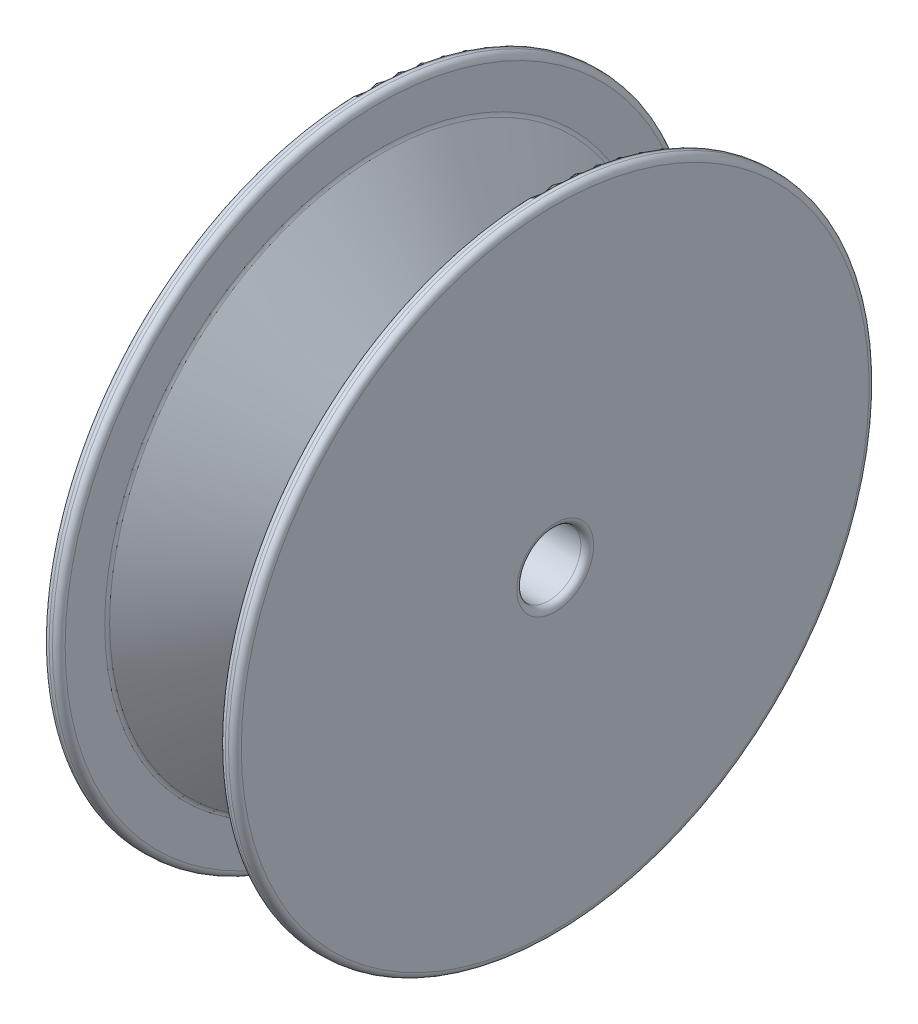
ISO-10303-21;
HEADER;
FILE_DESCRIPTION(('STEP AP214'),'2;1');
FILE_NAME('part.step','',(''),(''),'','','');
FILE_SCHEMA(('AUTOMOTIVE_DESIGN { 1 0 10303 214 1 1 1 1 }'));
ENDSEC;
DATA;
#1=APPLICATION_CONTEXT('core data for automotive mechanical design processes');
#2=APPLICATION_PROTOCOL_DEFINITION('international standard','automotive_design',2000,#1);
#3=PRODUCT_CONTEXT('',#1,'mechanical');
#4=PRODUCT('Part','Part','',(#3));
#5=PRODUCT_RELATED_PRODUCT_CATEGORY('part','',(#4));
#6=PRODUCT_DEFINITION_FORMATION('','',#4);
#7=PRODUCT_DEFINITION_CONTEXT('part definition',#1,'design');
#8=PRODUCT_DEFINITION('design','',#6,#7);
#9=PRODUCT_DEFINITION_SHAPE('','',#8);
#10=(LENGTH_UNIT() NAMED_UNIT(*) SI_UNIT(.MILLI.,.METRE.));
#11=(NAMED_UNIT(*) PLANE_ANGLE_UNIT() SI_UNIT($,.RADIAN.));
#12=(NAMED_UNIT(*) SI_UNIT($,.STERADIAN.) SOLID_ANGLE_UNIT());
#13=UNCERTAINTY_MEASURE_WITH_UNIT(LENGTH_MEASURE(1.E-05),#10,'distance_accuracy_value','');
#14=(GEOMETRIC_REPRESENTATION_CONTEXT(3) GLOBAL_UNCERTAINTY_ASSIGNED_CONTEXT((#13)) GLOBAL_UNIT_ASSIGNED_CONTEXT((#10,
#11,#12)) REPRESENTATION_CONTEXT('',''));
#15=CARTESIAN_POINT('',(0.,0.,0.));
#16=DIRECTION('',(0.,0.,1.));
#17=DIRECTION('',(1.,0.,0.));
#18=AXIS2_PLACEMENT_3D('',#15,#16,#17);
#19=CARTESIAN_POINT('',(0.,0.,0.));
#20=DIRECTION('',(-1.,0.,0.));
#21=DIRECTION('',(0.,0.,1.));
#22=AXIS2_PLACEMENT_3D('',#19,#20,#21);
#23=CYLINDRICAL_SURFACE('',#22,1.);
#24=CARTESIAN_POINT('',(2.8,0.,0.));
#25=DIRECTION('',(-1.,0.,0.));
#26=DIRECTION('',(0.,0.,1.));
#27=AXIS2_PLACEMENT_3D('',#24,#25,#26);
#28=CIRCLE('',#27,1.);
#29=CARTESIAN_POINT('',(2.8,0.,1.));
#30=VERTEX_POINT('',#29);
#31=EDGE_CURVE('E52',#30,#30,#28,.F.);
#32=ORIENTED_EDGE('',*,*,#31,.T.);
#33=EDGE_LOOP('',(#32));
#34=FACE_BOUND('',#33,.T.);
#35=CARTESIAN_POINT('',(-2.8,0.,0.));
#36=DIRECTION('',(1.,0.,0.));
#37=DIRECTION('',(0.,0.,-1.));
#38=AXIS2_PLACEMENT_3D('',#35,#36,#37);
#39=CIRCLE('',#38,1.);
#40=CARTESIAN_POINT('',(-2.8,0.,-1.));
#41=VERTEX_POINT('',#40);
#42=EDGE_CURVE('E56',#41,#41,#39,.F.);
#43=ORIENTED_EDGE('',*,*,#42,.T.);
#44=EDGE_LOOP('',(#43));
#45=FACE_BOUND('',#44,.T.);
#46=ADVANCED_FACE('F39',(#34,#45),#23,.F.);
#47=CARTESIAN_POINT('',(3.,1.,0.));
#48=DIRECTION('',(-1.,0.,0.));
#49=DIRECTION('',(0.,0.,1.));
#50=AXIS2_PLACEMENT_3D('',#47,#48,#49);
#51=PLANE('',#50);
#52=CARTESIAN_POINT('',(3.,0.,0.));
#53=DIRECTION('',(-1.,0.,0.));
#54=DIRECTION('',(0.,0.,1.));
#55=AXIS2_PLACEMENT_3D('',#52,#53,#54);
#56=CIRCLE('',#55,1.2);
#57=CARTESIAN_POINT('',(3.,0.,1.2));
#58=VERTEX_POINT('',#57);
#59=EDGE_CURVE('E61',#58,#58,#56,.T.);
#60=ORIENTED_EDGE('',*,*,#59,.T.);
#61=EDGE_LOOP('',(#60));
#62=FACE_BOUND('',#61,.T.);
#63=CARTESIAN_POINT('',(3.,0.,0.));
#64=DIRECTION('',(-1.,0.,0.));
#65=DIRECTION('',(0.,0.,1.));
#66=AXIS2_PLACEMENT_3D('',#63,#64,#65);
#67=CIRCLE('',#66,9.8);
#68=CARTESIAN_POINT('',(3.,0.,9.8));
#69=VERTEX_POINT('',#68);
#70=EDGE_CURVE('E64',#69,#69,#67,.F.);
#71=ORIENTED_EDGE('',*,*,#70,.T.);
#72=EDGE_LOOP('',(#71));
#73=FACE_BOUND('',#72,.T.);
#74=ADVANCED_FACE('F144',(#62,#73),#51,.F.);
#75=CARTESIAN_POINT('',(0.,0.,0.));
#76=DIRECTION('',(-1.,0.,0.));
#77=DIRECTION('',(0.,0.,1.));
#78=AXIS2_PLACEMENT_3D('',#75,#76,#77);
#79=CYLINDRICAL_SURFACE('',#78,10.);
#80=CARTESIAN_POINT('',(2.69999999999999,0.,0.));
#81=DIRECTION('',(1.,0.,0.));
#82=DIRECTION('',(0.,0.,-1.));
#83=AXIS2_PLACEMENT_3D('',#80,#81,#82);
#84=CIRCLE('',#83,10.);
#85=CARTESIAN_POINT('',(2.69999999999999,0.,-10.));
#86=VERTEX_POINT('',#85);
#87=EDGE_CURVE('E92',#86,#86,#84,.T.);
#88=ORIENTED_EDGE('',*,*,#87,.T.);
#89=EDGE_LOOP('',(#88));
#90=FACE_BOUND('',#89,.T.);
#91=CARTESIAN_POINT('',(2.8,0.,0.));
#92=DIRECTION('',(-1.,0.,0.));
#93=DIRECTION('',(0.,0.,1.));
#94=AXIS2_PLACEMENT_3D('',#91,#92,#93);
#95=CIRCLE('',#94,10.);
#96=CARTESIAN_POINT('',(2.8,0.,10.));
#97=VERTEX_POINT('',#96);
#98=EDGE_CURVE('E95',#97,#97,#95,.T.);
#99=ORIENTED_EDGE('',*,*,#98,.T.);
#100=EDGE_LOOP('',(#99));
#101=FACE_BOUND('',#100,.T.);
#102=ADVANCED_FACE('F149',(#90,#101),#79,.T.);
#103=CARTESIAN_POINT('',(2.49999999999999,8.5,0.));
#104=DIRECTION('',(1.,0.,0.));
#105=DIRECTION('',(0.,0.,-1.));
#106=AXIS2_PLACEMENT_3D('',#103,#104,#105);
#107=PLANE('',#106);
#108=CARTESIAN_POINT('',(2.49999999999999,0.,0.));
#109=DIRECTION('',(1.,0.,0.));
#110=DIRECTION('',(0.,0.,-1.));
#111=AXIS2_PLACEMENT_3D('',#108,#109,#110);
#112=CIRCLE('',#111,9.8);
#113=CARTESIAN_POINT('',(2.49999999999999,0.,-9.8));
#114=VERTEX_POINT('',#113);
#115=EDGE_CURVE('E98',#114,#114,#112,.F.);
#116=ORIENTED_EDGE('',*,*,#115,.T.);
#117=EDGE_LOOP('',(#116));
#118=FACE_BOUND('',#117,.T.);
#119=CARTESIAN_POINT('',(2.49999999999999,0.,0.));
#120=DIRECTION('',(1.,0.,0.));
#121=DIRECTION('',(0.,0.,-1.));
#122=AXIS2_PLACEMENT_3D('',#119,#120,#121);
#123=CIRCLE('',#122,8.56409301068169);
#124=CARTESIAN_POINT('',(2.49999999999999,0.,-8.56409301068169));
#125=VERTEX_POINT('',#124);
#126=EDGE_CURVE('E101',#125,#125,#123,.T.);
#127=ORIENTED_EDGE('',*,*,#126,.T.);
#128=EDGE_LOOP('',(#127));
#129=FACE_BOUND('',#128,.T.);
#130=ADVANCED_FACE('F172',(#118,#129),#107,.F.);
#131=CARTESIAN_POINT('',(2.5,0.,0.));
#132=DIRECTION('',(1.,0.,0.));
#133=DIRECTION('',(0.,0.,-1.));
#134=AXIS2_PLACEMENT_3D('',#131,#132,#133);
#135=CONICAL_SURFACE('',#134,8.5,0.95054684081207);
#136=CARTESIAN_POINT('',(2.46274669424133,0.,0.));
#137=DIRECTION('',(1.,0.,0.));
#138=DIRECTION('',(0.,0.,-1.));
#139=AXIS2_PLACEMENT_3D('',#136,#137,#138);
#140=CIRCLE('',#139,8.44784537193787);
#141=CARTESIAN_POINT('',(2.46274669424133,0.,-8.44784537193787));
#142=VERTEX_POINT('',#141);
#143=EDGE_CURVE('E86',#142,#142,#140,.F.);
#144=ORIENTED_EDGE('',*,*,#143,.T.);
#145=EDGE_LOOP('',(#144));
#146=FACE_BOUND('',#145,.T.);
#147=CARTESIAN_POINT('',(0.162746694241322,0.,0.));
#148=DIRECTION('',(1.,0.,0.));
#149=DIRECTION('',(0.,0.,-1.));
#150=AXIS2_PLACEMENT_3D('',#147,#148,#149);
#151=CIRCLE('',#150,5.22784537193789);
#152=CARTESIAN_POINT('',(0.162746694241322,0.,-5.22784537193789));
#153=VERTEX_POINT('',#152);
#154=EDGE_CURVE('E89',#153,#153,#151,.T.);
#155=ORIENTED_EDGE('',*,*,#154,.T.);
#156=EDGE_LOOP('',(#155));
#157=FACE_BOUND('',#156,.T.);
#158=ADVANCED_FACE('F178',(#146,#157),#135,.T.);
#159=CARTESIAN_POINT('',(0.,0.,0.));
#160=DIRECTION('',(-1.,0.,0.));
#161=DIRECTION('',(0.,0.,1.));
#162=AXIS2_PLACEMENT_3D('',#159,#160,#161);
#163=CONICAL_SURFACE('',#162,5.,0.95054684081208);
#164=CARTESIAN_POINT('',(-0.162746694241372,0.,0.));
#165=DIRECTION('',(-1.,0.,0.));
#166=DIRECTION('',(0.,0.,1.));
#167=AXIS2_PLACEMENT_3D('',#164,#165,#166);
#168=CIRCLE('',#167,5.22784537193789);
#169=CARTESIAN_POINT('',(-0.162746694241372,0.,5.22784537193789));
#170=VERTEX_POINT('',#169);
#171=EDGE_CURVE('E80',#170,#170,#168,.T.);
#172=ORIENTED_EDGE('',*,*,#171,.T.);
#173=EDGE_LOOP('',(#172));
#174=FACE_BOUND('',#173,.T.);
#175=CARTESIAN_POINT('',(-2.46274669424135,0.,0.));
#176=DIRECTION('',(-1.,0.,0.));
#177=DIRECTION('',(0.,0.,1.));
#178=AXIS2_PLACEMENT_3D('',#175,#176,#177);
#179=CIRCLE('',#178,8.44784537193789);
#180=CARTESIAN_POINT('',(-2.46274669424135,0.,8.44784537193789));
#181=VERTEX_POINT('',#180);
#182=EDGE_CURVE('E83',#181,#181,#179,.F.);
#183=ORIENTED_EDGE('',*,*,#182,.T.);
#184=EDGE_LOOP('',(#183));
#185=FACE_BOUND('',#184,.T.);
#186=ADVANCED_FACE('F184',(#174,#185),#163,.T.);
#187=CARTESIAN_POINT('',(-2.5,10.,0.));
#188=DIRECTION('',(-1.,0.,0.));
#189=DIRECTION('',(0.,0.,1.));
#190=AXIS2_PLACEMENT_3D('',#187,#188,#189);
#191=PLANE('',#190);
#192=CARTESIAN_POINT('',(-2.5,0.,0.));
#193=DIRECTION('',(-1.,0.,0.));
#194=DIRECTION('',(0.,0.,1.));
#195=AXIS2_PLACEMENT_3D('',#192,#193,#194);
#196=CIRCLE('',#195,8.5640930106817);
#197=CARTESIAN_POINT('',(-2.5,0.,8.5640930106817));
#198=VERTEX_POINT('',#197);
#199=EDGE_CURVE('E74',#198,#198,#196,.T.);
#200=ORIENTED_EDGE('',*,*,#199,.T.);
#201=EDGE_LOOP('',(#200));
#202=FACE_BOUND('',#201,.T.);
#203=CARTESIAN_POINT('',(-2.5,0.,0.));
#204=DIRECTION('',(-1.,0.,0.));
#205=DIRECTION('',(0.,0.,1.));
#206=AXIS2_PLACEMENT_3D('',#203,#204,#205);
#207=CIRCLE('',#206,9.8);
#208=CARTESIAN_POINT('',(-2.5,0.,9.8));
#209=VERTEX_POINT('',#208);
#210=EDGE_CURVE('E77',#209,#209,#207,.F.);
#211=ORIENTED_EDGE('',*,*,#210,.T.);
#212=EDGE_LOOP('',(#211));
#213=FACE_BOUND('',#212,.T.);
#214=ADVANCED_FACE('F188',(#202,#213),#191,.F.);
#215=CARTESIAN_POINT('',(0.,0.,0.));
#216=DIRECTION('',(-1.,0.,0.));
#217=DIRECTION('',(0.,0.,1.));
#218=AXIS2_PLACEMENT_3D('',#215,#216,#217);
#219=CYLINDRICAL_SURFACE('',#218,10.);
#220=CARTESIAN_POINT('',(-2.7,0.,0.));
#221=DIRECTION('',(-1.,0.,0.));
#222=DIRECTION('',(0.,0.,1.));
#223=AXIS2_PLACEMENT_3D('',#220,#221,#222);
#224=CIRCLE('',#223,10.);
#225=CARTESIAN_POINT('',(-2.7,0.,10.));
#226=VERTEX_POINT('',#225);
#227=EDGE_CURVE('E67',#226,#226,#224,.T.);
#228=ORIENTED_EDGE('',*,*,#227,.T.);
#229=EDGE_LOOP('',(#228));
#230=FACE_BOUND('',#229,.T.);
#231=CARTESIAN_POINT('',(-2.8,0.,0.));
#232=DIRECTION('',(1.,0.,0.));
#233=DIRECTION('',(0.,0.,-1.));
#234=AXIS2_PLACEMENT_3D('',#231,#232,#233);
#235=CIRCLE('',#234,10.);
#236=CARTESIAN_POINT('',(-2.8,0.,-10.));
#237=VERTEX_POINT('',#236);
#238=EDGE_CURVE('E69',#237,#237,#235,.T.);
#239=ORIENTED_EDGE('',*,*,#238,.T.);
#240=EDGE_LOOP('',(#239));
#241=FACE_BOUND('',#240,.T.);
#242=ADVANCED_FACE('F123',(#230,#241),#219,.T.);
#243=CARTESIAN_POINT('',(-3.,1.,0.));
#244=DIRECTION('',(1.,0.,0.));
#245=DIRECTION('',(0.,0.,-1.));
#246=AXIS2_PLACEMENT_3D('',#243,#244,#245);
#247=PLANE('',#246);
#248=CARTESIAN_POINT('',(-3.,-6.53003817560782,0.));
#249=DIRECTION('',(-1.,0.,0.));
#250=DIRECTION('',(0.,0.,-1.));
#251=AXIS2_PLACEMENT_3D('',#248,#249,#250);
#252=CIRCLE('',#251,0.843426549744777);
#253=CARTESIAN_POINT('',(-3.,-6.53003817560782,-0.843426549744777));
#254=VERTEX_POINT('',#253);
#255=EDGE_CURVE('E113',#254,#254,#252,.T.);
#256=ORIENTED_EDGE('',*,*,#255,.F.);
#257=EDGE_LOOP('',(#256));
#258=FACE_BOUND('',#257,.T.);
#259=CARTESIAN_POINT('',(-3.,6.53003817560782,0.));
#260=DIRECTION('',(-1.,0.,0.));
#261=DIRECTION('',(0.,0.,1.));
#262=AXIS2_PLACEMENT_3D('',#259,#260,#261);
#263=CIRCLE('',#262,0.843426549744777);
#264=CARTESIAN_POINT('',(-3.,6.53003817560782,0.843426549744777));
#265=VERTEX_POINT('',#264);
#266=EDGE_CURVE('E107',#265,#265,#263,.T.);
#267=ORIENTED_EDGE('',*,*,#266,.F.);
#268=EDGE_LOOP('',(#267));
#269=FACE_BOUND('',#268,.T.);
#270=CARTESIAN_POINT('',(-3.,0.,0.));
#271=DIRECTION('',(1.,0.,0.));
#272=DIRECTION('',(0.,0.,-1.));
#273=AXIS2_PLACEMENT_3D('',#270,#271,#272);
#274=CIRCLE('',#273,9.8);
#275=CARTESIAN_POINT('',(-3.,0.,-9.8));
#276=VERTEX_POINT('',#275);
#277=EDGE_CURVE('E11',#276,#276,#274,.F.);
#278=ORIENTED_EDGE('',*,*,#277,.T.);
#279=EDGE_LOOP('',(#278));
#280=FACE_BOUND('',#279,.T.);
#281=CARTESIAN_POINT('',(-3.,0.,0.));
#282=DIRECTION('',(1.,0.,0.));
#283=DIRECTION('',(0.,0.,-1.));
#284=AXIS2_PLACEMENT_3D('',#281,#282,#283);
#285=CIRCLE('',#284,1.2);
#286=CARTESIAN_POINT('',(-3.,0.,-1.2));
#287=VERTEX_POINT('',#286);
#288=EDGE_CURVE('E46',#287,#287,#285,.T.);
#289=ORIENTED_EDGE('',*,*,#288,.T.);
#290=EDGE_LOOP('',(#289));
#291=FACE_BOUND('',#290,.T.);
#292=ADVANCED_FACE('F119',(#258,#269,#280,#291),#247,.F.);
#293=CARTESIAN_POINT('',(2.69999999999999,0.,0.));
#294=DIRECTION('',(1.,0.,0.));
#295=DIRECTION('',(0.,0.,-1.));
#296=AXIS2_PLACEMENT_3D('',#293,#294,#295);
#297=TOROIDAL_SURFACE('',#296,9.8,0.2);
#298=ORIENTED_EDGE('',*,*,#87,.F.);
#299=EDGE_LOOP('',(#298));
#300=FACE_BOUND('',#299,.T.);
#301=ORIENTED_EDGE('',*,*,#115,.F.);
#302=EDGE_LOOP('',(#301));
#303=FACE_BOUND('',#302,.T.);
#304=ADVANCED_FACE('F122',(#300,#303),#297,.T.);
#305=CARTESIAN_POINT('',(2.29999999999999,0.,0.));
#306=DIRECTION('',(1.,0.,0.));
#307=DIRECTION('',(0.,0.,-1.));
#308=AXIS2_PLACEMENT_3D('',#305,#306,#307);
#309=TOROIDAL_SURFACE('',#308,8.56409301068169,0.2);
#310=ORIENTED_EDGE('',*,*,#126,.F.);
#311=EDGE_LOOP('',(#310));
#312=FACE_BOUND('',#311,.T.);
#313=ORIENTED_EDGE('',*,*,#143,.F.);
#314=EDGE_LOOP('',(#313));
#315=FACE_BOUND('',#314,.T.);
#316=ADVANCED_FACE('F198',(#312,#315),#309,.F.);
#317=CARTESIAN_POINT('',(0.,0.,0.));
#318=DIRECTION('',(-1.,0.,0.));
#319=DIRECTION('',(0.,0.,1.));
#320=AXIS2_PLACEMENT_3D('',#317,#318,#319);
#321=TOROIDAL_SURFACE('',#320,5.34409301068171,0.2);
#322=ORIENTED_EDGE('',*,*,#154,.F.);
#323=EDGE_LOOP('',(#322));
#324=FACE_BOUND('',#323,.T.);
#325=ORIENTED_EDGE('',*,*,#171,.F.);
#326=EDGE_LOOP('',(#325));
#327=FACE_BOUND('',#326,.T.);
#328=ADVANCED_FACE('F202',(#324,#327),#321,.F.);
#329=CARTESIAN_POINT('',(-2.3,0.,0.));
#330=DIRECTION('',(-1.,0.,0.));
#331=DIRECTION('',(0.,0.,1.));
#332=AXIS2_PLACEMENT_3D('',#329,#330,#331);
#333=TOROIDAL_SURFACE('',#332,8.5640930106817,0.2);
#334=ORIENTED_EDGE('',*,*,#182,.F.);
#335=EDGE_LOOP('',(#334));
#336=FACE_BOUND('',#335,.T.);
#337=ORIENTED_EDGE('',*,*,#199,.F.);
#338=EDGE_LOOP('',(#337));
#339=FACE_BOUND('',#338,.T.);
#340=ADVANCED_FACE('F206',(#336,#339),#333,.F.);
#341=CARTESIAN_POINT('',(-2.7,0.,0.));
#342=DIRECTION('',(-1.,0.,0.));
#343=DIRECTION('',(0.,0.,1.));
#344=AXIS2_PLACEMENT_3D('',#341,#342,#343);
#345=TOROIDAL_SURFACE('',#344,9.8,0.2);
#346=ORIENTED_EDGE('',*,*,#210,.F.);
#347=EDGE_LOOP('',(#346));
#348=FACE_BOUND('',#347,.T.);
#349=ORIENTED_EDGE('',*,*,#227,.F.);
#350=EDGE_LOOP('',(#349));
#351=FACE_BOUND('',#350,.T.);
#352=ADVANCED_FACE('F160',(#348,#351),#345,.T.);
#353=CARTESIAN_POINT('',(2.8,0.,0.));
#354=DIRECTION('',(-1.,0.,0.));
#355=DIRECTION('',(0.,0.,1.));
#356=AXIS2_PLACEMENT_3D('',#353,#354,#355);
#357=TOROIDAL_SURFACE('',#356,1.2,0.2);
#358=ORIENTED_EDGE('',*,*,#31,.F.);
#359=EDGE_LOOP('',(#358));
#360=FACE_BOUND('',#359,.T.);
#361=ORIENTED_EDGE('',*,*,#59,.F.);
#362=EDGE_LOOP('',(#361));
#363=FACE_BOUND('',#362,.T.);
#364=ADVANCED_FACE('F156',(#360,#363),#357,.T.);
#365=CARTESIAN_POINT('',(2.8,0.,0.));
#366=DIRECTION('',(-1.,0.,0.));
#367=DIRECTION('',(0.,0.,1.));
#368=AXIS2_PLACEMENT_3D('',#365,#366,#367);
#369=TOROIDAL_SURFACE('',#368,9.8,0.2);
#370=ORIENTED_EDGE('',*,*,#70,.F.);
#371=EDGE_LOOP('',(#370));
#372=FACE_BOUND('',#371,.T.);
#373=ORIENTED_EDGE('',*,*,#98,.F.);
#374=EDGE_LOOP('',(#373));
#375=FACE_BOUND('',#374,.T.);
#376=ADVANCED_FACE('F159',(#372,#375),#369,.T.);
#377=CARTESIAN_POINT('',(-2.8,0.,0.));
#378=DIRECTION('',(1.,0.,0.));
#379=DIRECTION('',(0.,0.,-1.));
#380=AXIS2_PLACEMENT_3D('',#377,#378,#379);
#381=TOROIDAL_SURFACE('',#380,9.8,0.2);
#382=ORIENTED_EDGE('',*,*,#238,.F.);
#383=EDGE_LOOP('',(#382));
#384=FACE_BOUND('',#383,.T.);
#385=ORIENTED_EDGE('',*,*,#277,.F.);
#386=EDGE_LOOP('',(#385));
#387=FACE_BOUND('',#386,.T.);
#388=ADVANCED_FACE('F139',(#384,#387),#381,.T.);
#389=CARTESIAN_POINT('',(-2.8,0.,0.));
#390=DIRECTION('',(1.,0.,0.));
#391=DIRECTION('',(0.,0.,-1.));
#392=AXIS2_PLACEMENT_3D('',#389,#390,#391);
#393=TOROIDAL_SURFACE('',#392,1.2,0.2);
#394=ORIENTED_EDGE('',*,*,#288,.F.);
#395=EDGE_LOOP('',(#394));
#396=FACE_BOUND('',#395,.T.);
#397=ORIENTED_EDGE('',*,*,#42,.F.);
#398=EDGE_LOOP('',(#397));
#399=FACE_BOUND('',#398,.T.);
#400=ADVANCED_FACE('F130',(#396,#399),#393,.T.);
#401=CARTESIAN_POINT('',(-2.75,6.53003817560782,0.));
#402=DIRECTION('',(-1.,0.,0.));
#403=DIRECTION('',(0.,0.,1.));
#404=AXIS2_PLACEMENT_3D('',#401,#402,#403);
#405=CYLINDRICAL_SURFACE('',#404,0.843426549744777);
#406=CARTESIAN_POINT('',(-2.75,6.53003817560782,0.));
#407=DIRECTION('',(-1.,0.,0.));
#408=DIRECTION('',(0.,0.,1.));
#409=AXIS2_PLACEMENT_3D('',#406,#407,#408);
#410=CIRCLE('',#409,0.843426549744777);
#411=CARTESIAN_POINT('',(-2.75,6.53003817560782,0.843426549744777));
#412=VERTEX_POINT('',#411);
#413=EDGE_CURVE('E104',#412,#412,#410,.T.);
#414=ORIENTED_EDGE('',*,*,#413,.F.);
#415=EDGE_LOOP('',(#414));
#416=FACE_BOUND('',#415,.T.);
#417=ORIENTED_EDGE('',*,*,#266,.T.);
#418=EDGE_LOOP('',(#417));
#419=FACE_BOUND('',#418,.T.);
#420=ADVANCED_FACE('F127',(#416,#419),#405,.F.);
#421=CARTESIAN_POINT('',(-2.75,6.53003817560782,0.));
#422=DIRECTION('',(-1.,0.,0.));
#423=DIRECTION('',(0.,0.,1.));
#424=AXIS2_PLACEMENT_3D('',#421,#422,#423);
#425=PLANE('',#424);
#426=ORIENTED_EDGE('',*,*,#413,.T.);
#427=EDGE_LOOP('',(#426));
#428=FACE_BOUND('',#427,.T.);
#429=ADVANCED_FACE('F129',(#428),#425,.T.);
#430=CARTESIAN_POINT('',(-2.75,-6.53003817560782,0.));
#431=DIRECTION('',(-1.,0.,0.));
#432=DIRECTION('',(0.,0.,1.));
#433=AXIS2_PLACEMENT_3D('',#430,#431,#432);
#434=CYLINDRICAL_SURFACE('',#433,0.843426549744777);
#435=CARTESIAN_POINT('',(-2.75,-6.53003817560782,0.));
#436=DIRECTION('',(-1.,0.,0.));
#437=DIRECTION('',(0.,0.,-1.));
#438=AXIS2_PLACEMENT_3D('',#435,#436,#437);
#439=CIRCLE('',#438,0.843426549744777);
#440=CARTESIAN_POINT('',(-2.75,-6.53003817560782,-0.843426549744777));
#441=VERTEX_POINT('',#440);
#442=EDGE_CURVE('E110',#441,#441,#439,.T.);
#443=ORIENTED_EDGE('',*,*,#442,.F.);
#444=EDGE_LOOP('',(#443));
#445=FACE_BOUND('',#444,.T.);
#446=ORIENTED_EDGE('',*,*,#255,.T.);
#447=EDGE_LOOP('',(#446));
#448=FACE_BOUND('',#447,.T.);
#449=ADVANCED_FACE('F117',(#445,#448),#434,.F.);
#450=CARTESIAN_POINT('',(-2.75,-6.53003817560782,0.));
#451=DIRECTION('',(1.,0.,0.));
#452=DIRECTION('',(0.,0.,-1.));
#453=AXIS2_PLACEMENT_3D('',#450,#451,#452);
#454=PLANE('',#453);
#455=ORIENTED_EDGE('',*,*,#442,.T.);
#456=EDGE_LOOP('',(#455));
#457=FACE_BOUND('',#456,.T.);
#458=ADVANCED_FACE('F255',(#457),#454,.F.);
#459=CLOSED_SHELL('',(#46,#74,#102,#130,#158,#186,#214,#242,#292,#304,#316,#328,#340,#352,#364,
#376,#388,#400,#420,#429,#449,#458));
#460=MANIFOLD_SOLID_BREP('B2',#459);
#461=ADVANCED_BREP_SHAPE_REPRESENTATION('',(#18,#460),#14);
#462=SHAPE_DEFINITION_REPRESENTATION(#9,#461);
ENDSEC;
END-ISO-10303-21;
